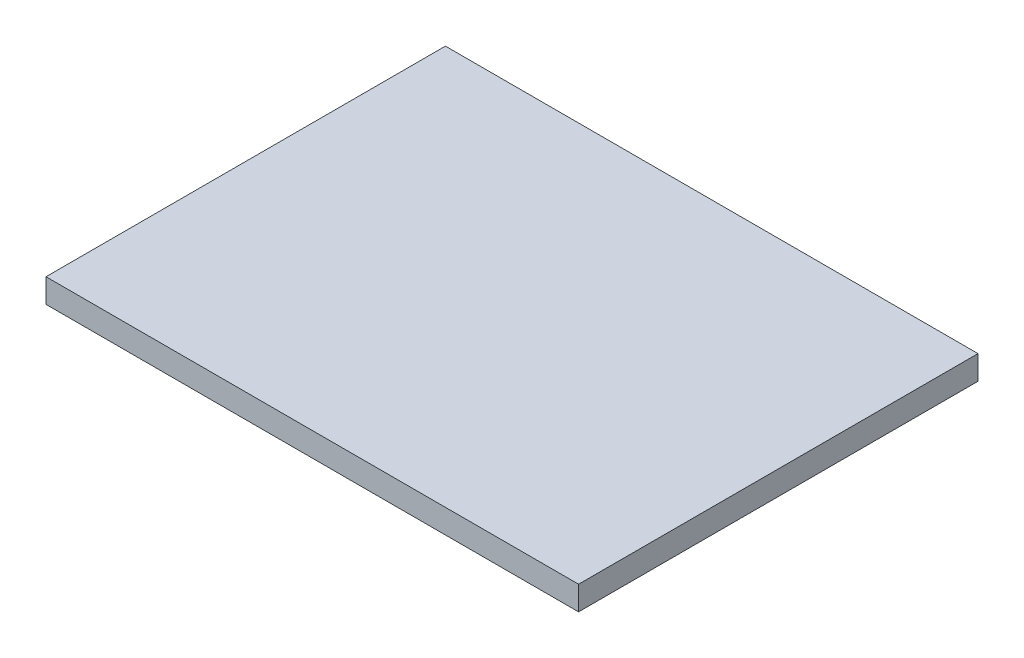
ISO-10303-21;
HEADER;
FILE_DESCRIPTION(('STEP AP214'),'2;1');
FILE_NAME('part.step','',(''),(''),'','','');
FILE_SCHEMA(('AUTOMOTIVE_DESIGN { 1 0 10303 214 1 1 1 1 }'));
ENDSEC;
DATA;
#1=APPLICATION_CONTEXT('core data for automotive mechanical design processes');
#2=APPLICATION_PROTOCOL_DEFINITION('international standard','automotive_design',2000,#1);
#3=PRODUCT_CONTEXT('',#1,'mechanical');
#4=PRODUCT('Part','Part','',(#3));
#5=PRODUCT_RELATED_PRODUCT_CATEGORY('part','',(#4));
#6=PRODUCT_DEFINITION_FORMATION('','',#4);
#7=PRODUCT_DEFINITION_CONTEXT('part definition',#1,'design');
#8=PRODUCT_DEFINITION('design','',#6,#7);
#9=PRODUCT_DEFINITION_SHAPE('','',#8);
#10=(LENGTH_UNIT() NAMED_UNIT(*) SI_UNIT(.MILLI.,.METRE.));
#11=(NAMED_UNIT(*) PLANE_ANGLE_UNIT() SI_UNIT($,.RADIAN.));
#12=(NAMED_UNIT(*) SI_UNIT($,.STERADIAN.) SOLID_ANGLE_UNIT());
#13=UNCERTAINTY_MEASURE_WITH_UNIT(LENGTH_MEASURE(1.E-05),#10,'distance_accuracy_value','');
#14=(GEOMETRIC_REPRESENTATION_CONTEXT(3) GLOBAL_UNCERTAINTY_ASSIGNED_CONTEXT((#13)) GLOBAL_UNIT_ASSIGNED_CONTEXT((#10,
#11,#12)) REPRESENTATION_CONTEXT('',''));
#15=CARTESIAN_POINT('',(0.,0.,0.));
#16=DIRECTION('',(0.,0.,1.));
#17=DIRECTION('',(1.,0.,0.));
#18=AXIS2_PLACEMENT_3D('',#15,#16,#17);
#19=CARTESIAN_POINT('',(0.,18.,0.));
#20=DIRECTION('',(1.,0.,0.));
#21=DIRECTION('',(0.,0.,-1.));
#22=AXIS2_PLACEMENT_3D('',#19,#20,#21);
#23=PLANE('',#22);
#24=DIRECTION('',(0.,0.,1.));
#25=VECTOR('',#24,1.);
#26=CARTESIAN_POINT('',(0.,0.,0.));
#27=LINE('',#26,#25);
#28=CARTESIAN_POINT('',(-1.11022302462516E-13,0.,-300.));
#29=VERTEX_POINT('',#28);
#30=CARTESIAN_POINT('',(0.,0.,0.));
#31=VERTEX_POINT('',#30);
#32=EDGE_CURVE('E111',#29,#31,#27,.T.);
#33=ORIENTED_EDGE('',*,*,#32,.T.);
#34=DIRECTION('',(0.,-1.,0.));
#35=VECTOR('',#34,1.);
#36=CARTESIAN_POINT('',(0.,18.,0.));
#37=LINE('',#36,#35);
#38=CARTESIAN_POINT('',(0.,18.,0.));
#39=VERTEX_POINT('',#38);
#40=EDGE_CURVE('E11',#39,#31,#37,.T.);
#41=ORIENTED_EDGE('',*,*,#40,.F.);
#42=DIRECTION('',(0.,0.,1.));
#43=VECTOR('',#42,1.);
#44=CARTESIAN_POINT('',(0.,18.,0.));
#45=LINE('',#44,#43);
#46=CARTESIAN_POINT('',(-1.11022302462516E-13,18.,-300.));
#47=VERTEX_POINT('',#46);
#48=EDGE_CURVE('E95',#47,#39,#45,.T.);
#49=ORIENTED_EDGE('',*,*,#48,.F.);
#50=DIRECTION('',(0.,-1.,0.));
#51=VECTOR('',#50,1.);
#52=CARTESIAN_POINT('',(-1.11022302462516E-13,18.,-300.));
#53=LINE('',#52,#51);
#54=EDGE_CURVE('E107',#47,#29,#53,.T.);
#55=ORIENTED_EDGE('',*,*,#54,.T.);
#56=EDGE_LOOP('',(#33,#41,#49,#55));
#57=FACE_BOUND('',#56,.T.);
#58=ADVANCED_FACE('F43',(#57),#23,.F.);
#59=CARTESIAN_POINT('',(0.,18.,0.));
#60=DIRECTION('',(0.,0.,-1.));
#61=DIRECTION('',(-1.,0.,0.));
#62=AXIS2_PLACEMENT_3D('',#59,#60,#61);
#63=PLANE('',#62);
#64=DIRECTION('',(1.,0.,0.));
#65=VECTOR('',#64,1.);
#66=CARTESIAN_POINT('',(0.,0.,0.));
#67=LINE('',#66,#65);
#68=CARTESIAN_POINT('',(400.,0.,0.));
#69=VERTEX_POINT('',#68);
#70=EDGE_CURVE('E100',#31,#69,#67,.T.);
#71=ORIENTED_EDGE('',*,*,#70,.T.);
#72=DIRECTION('',(0.,-1.,0.));
#73=VECTOR('',#72,1.);
#74=CARTESIAN_POINT('',(400.,18.,0.));
#75=LINE('',#74,#73);
#76=CARTESIAN_POINT('',(400.,18.,0.));
#77=VERTEX_POINT('',#76);
#78=EDGE_CURVE('E52',#77,#69,#75,.T.);
#79=ORIENTED_EDGE('',*,*,#78,.F.);
#80=DIRECTION('',(1.,0.,0.));
#81=VECTOR('',#80,1.);
#82=CARTESIAN_POINT('',(0.,18.,0.));
#83=LINE('',#82,#81);
#84=EDGE_CURVE('E90',#39,#77,#83,.T.);
#85=ORIENTED_EDGE('',*,*,#84,.F.);
#86=ORIENTED_EDGE('',*,*,#40,.T.);
#87=EDGE_LOOP('',(#71,#79,#85,#86));
#88=FACE_BOUND('',#87,.T.);
#89=ADVANCED_FACE('F99',(#88),#63,.F.);
#90=CARTESIAN_POINT('',(400.,18.,0.));
#91=DIRECTION('',(-1.,0.,0.));
#92=DIRECTION('',(0.,0.,1.));
#93=AXIS2_PLACEMENT_3D('',#90,#91,#92);
#94=PLANE('',#93);
#95=DIRECTION('',(0.,0.,-1.));
#96=VECTOR('',#95,1.);
#97=CARTESIAN_POINT('',(400.,0.,0.));
#98=LINE('',#97,#96);
#99=CARTESIAN_POINT('',(400.,0.,-300.));
#100=VERTEX_POINT('',#99);
#101=EDGE_CURVE('E77',#69,#100,#98,.T.);
#102=ORIENTED_EDGE('',*,*,#101,.T.);
#103=DIRECTION('',(0.,-1.,0.));
#104=VECTOR('',#103,1.);
#105=CARTESIAN_POINT('',(400.,18.,-300.));
#106=LINE('',#105,#104);
#107=CARTESIAN_POINT('',(400.,18.,-300.));
#108=VERTEX_POINT('',#107);
#109=EDGE_CURVE('E102',#108,#100,#106,.T.);
#110=ORIENTED_EDGE('',*,*,#109,.F.);
#111=DIRECTION('',(0.,0.,-1.));
#112=VECTOR('',#111,1.);
#113=CARTESIAN_POINT('',(400.,18.,0.));
#114=LINE('',#113,#112);
#115=EDGE_CURVE('E93',#77,#108,#114,.T.);
#116=ORIENTED_EDGE('',*,*,#115,.F.);
#117=ORIENTED_EDGE('',*,*,#78,.T.);
#118=EDGE_LOOP('',(#102,#110,#116,#117));
#119=FACE_BOUND('',#118,.T.);
#120=ADVANCED_FACE('F103',(#119),#94,.F.);
#121=CARTESIAN_POINT('',(-1.11022302462516E-13,18.,-300.));
#122=DIRECTION('',(0.,0.,1.));
#123=DIRECTION('',(1.,0.,0.));
#124=AXIS2_PLACEMENT_3D('',#121,#122,#123);
#125=PLANE('',#124);
#126=DIRECTION('',(-1.,0.,0.));
#127=VECTOR('',#126,1.);
#128=CARTESIAN_POINT('',(-1.11022302462516E-13,0.,-300.));
#129=LINE('',#128,#127);
#130=EDGE_CURVE('E83',#100,#29,#129,.T.);
#131=ORIENTED_EDGE('',*,*,#130,.T.);
#132=ORIENTED_EDGE('',*,*,#54,.F.);
#133=DIRECTION('',(-1.,0.,0.));
#134=VECTOR('',#133,1.);
#135=CARTESIAN_POINT('',(-1.11022302462516E-13,18.,-300.));
#136=LINE('',#135,#134);
#137=EDGE_CURVE('E60',#108,#47,#136,.T.);
#138=ORIENTED_EDGE('',*,*,#137,.F.);
#139=ORIENTED_EDGE('',*,*,#109,.T.);
#140=EDGE_LOOP('',(#131,#132,#138,#139));
#141=FACE_BOUND('',#140,.T.);
#142=ADVANCED_FACE('F124',(#141),#125,.F.);
#143=CARTESIAN_POINT('',(0.,18.,0.));
#144=DIRECTION('',(0.,-1.,0.));
#145=DIRECTION('',(0.,0.,-1.));
#146=AXIS2_PLACEMENT_3D('',#143,#144,#145);
#147=PLANE('',#146);
#148=ORIENTED_EDGE('',*,*,#48,.T.);
#149=ORIENTED_EDGE('',*,*,#84,.T.);
#150=ORIENTED_EDGE('',*,*,#115,.T.);
#151=ORIENTED_EDGE('',*,*,#137,.T.);
#152=EDGE_LOOP('',(#148,#149,#150,#151));
#153=FACE_BOUND('',#152,.T.);
#154=ADVANCED_FACE('F91',(#153),#147,.F.);
#155=CARTESIAN_POINT('',(0.,0.,0.));
#156=DIRECTION('',(0.,-1.,0.));
#157=DIRECTION('',(0.,0.,-1.));
#158=AXIS2_PLACEMENT_3D('',#155,#156,#157);
#159=PLANE('',#158);
#160=ORIENTED_EDGE('',*,*,#32,.F.);
#161=ORIENTED_EDGE('',*,*,#130,.F.);
#162=ORIENTED_EDGE('',*,*,#101,.F.);
#163=ORIENTED_EDGE('',*,*,#70,.F.);
#164=EDGE_LOOP('',(#160,#161,#162,#163));
#165=FACE_BOUND('',#164,.T.);
#166=ADVANCED_FACE('F127',(#165),#159,.T.);
#167=CLOSED_SHELL('',(#58,#89,#120,#142,#154,#166));
#168=MANIFOLD_SOLID_BREP('B2',#167);
#169=ADVANCED_BREP_SHAPE_REPRESENTATION('',(#18,#168),#14);
#170=SHAPE_DEFINITION_REPRESENTATION(#9,#169);
ENDSEC;
END-ISO-10303-21;
